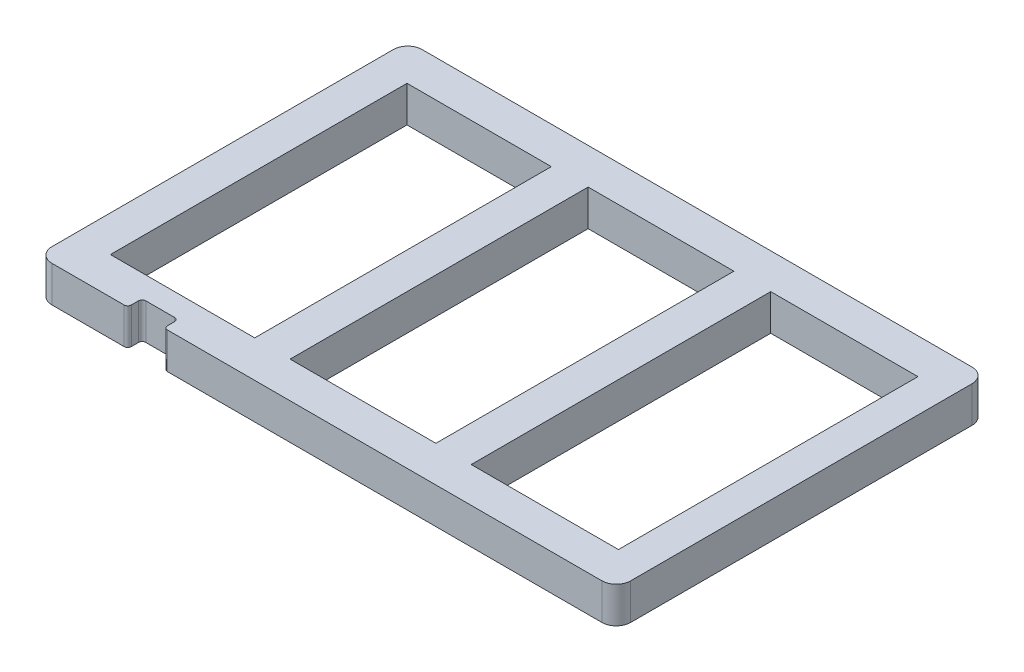
ISO-10303-21;
HEADER;
FILE_DESCRIPTION(('STEP AP214'),'2;1');
FILE_NAME('part.step','',(''),(''),'','','');
FILE_SCHEMA(('AUTOMOTIVE_DESIGN { 1 0 10303 214 1 1 1 1 }'));
ENDSEC;
DATA;
#1=APPLICATION_CONTEXT('core data for automotive mechanical design processes');
#2=APPLICATION_PROTOCOL_DEFINITION('international standard','automotive_design',2000,#1);
#3=PRODUCT_CONTEXT('',#1,'mechanical');
#4=PRODUCT('Part','Part','',(#3));
#5=PRODUCT_RELATED_PRODUCT_CATEGORY('part','',(#4));
#6=PRODUCT_DEFINITION_FORMATION('','',#4);
#7=PRODUCT_DEFINITION_CONTEXT('part definition',#1,'design');
#8=PRODUCT_DEFINITION('design','',#6,#7);
#9=PRODUCT_DEFINITION_SHAPE('','',#8);
#10=(LENGTH_UNIT() NAMED_UNIT(*) SI_UNIT(.MILLI.,.METRE.));
#11=(NAMED_UNIT(*) PLANE_ANGLE_UNIT() SI_UNIT($,.RADIAN.));
#12=(NAMED_UNIT(*) SI_UNIT($,.STERADIAN.) SOLID_ANGLE_UNIT());
#13=UNCERTAINTY_MEASURE_WITH_UNIT(LENGTH_MEASURE(1.E-05),#10,'distance_accuracy_value','');
#14=(GEOMETRIC_REPRESENTATION_CONTEXT(3) GLOBAL_UNCERTAINTY_ASSIGNED_CONTEXT((#13)) GLOBAL_UNIT_ASSIGNED_CONTEXT((#10,
#11,#12)) REPRESENTATION_CONTEXT('',''));
#15=CARTESIAN_POINT('',(0.,0.,0.));
#16=DIRECTION('',(0.,0.,1.));
#17=DIRECTION('',(1.,0.,0.));
#18=AXIS2_PLACEMENT_3D('',#15,#16,#17);
#19=CARTESIAN_POINT('',(3.,5.,25.15));
#20=DIRECTION('',(0.,1.,0.));
#21=DIRECTION('',(0.,0.,1.));
#22=AXIS2_PLACEMENT_3D('',#19,#20,#21);
#23=PLANE('',#22);
#24=CARTESIAN_POINT('',(3.,5.,25.15));
#25=DIRECTION('',(0.,1.,0.));
#26=DIRECTION('',(0.,0.,1.));
#27=AXIS2_PLACEMENT_3D('',#24,#25,#26);
#28=CIRCLE('',#27,0.5);
#29=CARTESIAN_POINT('',(2.5,5.,25.15));
#30=VERTEX_POINT('',#29);
#31=CARTESIAN_POINT('',(3.,5.,25.65));
#32=VERTEX_POINT('',#31);
#33=EDGE_CURVE('E320',#30,#32,#28,.T.);
#34=ORIENTED_EDGE('',*,*,#33,.T.);
#35=DIRECTION('',(1.,0.,0.));
#36=VECTOR('',#35,1.);
#37=CARTESIAN_POINT('',(63.2,5.,25.65));
#38=LINE('',#37,#36);
#39=CARTESIAN_POINT('',(63.2,5.,25.65));
#40=VERTEX_POINT('',#39);
#41=EDGE_CURVE('E323',#32,#40,#38,.T.);
#42=ORIENTED_EDGE('',*,*,#41,.T.);
#43=CARTESIAN_POINT('',(63.2,5.,23.65));
#44=DIRECTION('',(0.,1.,0.));
#45=DIRECTION('',(0.,0.,1.));
#46=AXIS2_PLACEMENT_3D('',#43,#44,#45);
#47=CIRCLE('',#46,2.);
#48=CARTESIAN_POINT('',(65.2,5.,23.65));
#49=VERTEX_POINT('',#48);
#50=EDGE_CURVE('E326',#40,#49,#47,.T.);
#51=ORIENTED_EDGE('',*,*,#50,.T.);
#52=DIRECTION('',(0.,0.,-1.));
#53=VECTOR('',#52,1.);
#54=CARTESIAN_POINT('',(65.2,5.,23.65));
#55=LINE('',#54,#53);
#56=CARTESIAN_POINT('',(65.2,5.,-23.65));
#57=VERTEX_POINT('',#56);
#58=EDGE_CURVE('E328',#49,#57,#55,.T.);
#59=ORIENTED_EDGE('',*,*,#58,.T.);
#60=CARTESIAN_POINT('',(63.2,5.,-23.65));
#61=DIRECTION('',(0.,1.,0.));
#62=DIRECTION('',(0.,0.,1.));
#63=AXIS2_PLACEMENT_3D('',#60,#61,#62);
#64=CIRCLE('',#63,2.);
#65=CARTESIAN_POINT('',(63.2,5.,-25.65));
#66=VERTEX_POINT('',#65);
#67=EDGE_CURVE('E330',#57,#66,#64,.T.);
#68=ORIENTED_EDGE('',*,*,#67,.T.);
#69=DIRECTION('',(-1.,0.,0.));
#70=VECTOR('',#69,1.);
#71=CARTESIAN_POINT('',(63.2,5.,-25.65));
#72=LINE('',#71,#70);
#73=CARTESIAN_POINT('',(-13.,5.,-25.65));
#74=VERTEX_POINT('',#73);
#75=EDGE_CURVE('E332',#66,#74,#72,.T.);
#76=ORIENTED_EDGE('',*,*,#75,.T.);
#77=CARTESIAN_POINT('',(-13.,5.,-23.65));
#78=DIRECTION('',(0.,1.,0.));
#79=DIRECTION('',(0.,0.,1.));
#80=AXIS2_PLACEMENT_3D('',#77,#78,#79);
#81=CIRCLE('',#80,2.);
#82=CARTESIAN_POINT('',(-15.,5.,-23.65));
#83=VERTEX_POINT('',#82);
#84=EDGE_CURVE('E334',#74,#83,#81,.T.);
#85=ORIENTED_EDGE('',*,*,#84,.T.);
#86=DIRECTION('',(0.,0.,1.));
#87=VECTOR('',#86,1.);
#88=CARTESIAN_POINT('',(-15.,5.,23.65));
#89=LINE('',#88,#87);
#90=CARTESIAN_POINT('',(-15.,5.,23.65));
#91=VERTEX_POINT('',#90);
#92=EDGE_CURVE('E336',#83,#91,#89,.T.);
#93=ORIENTED_EDGE('',*,*,#92,.T.);
#94=CARTESIAN_POINT('',(-13.,5.,23.65));
#95=DIRECTION('',(0.,1.,0.));
#96=DIRECTION('',(0.,0.,-1.));
#97=AXIS2_PLACEMENT_3D('',#94,#95,#96);
#98=CIRCLE('',#97,2.);
#99=CARTESIAN_POINT('',(-13.,5.,25.65));
#100=VERTEX_POINT('',#99);
#101=EDGE_CURVE('E338',#91,#100,#98,.T.);
#102=ORIENTED_EDGE('',*,*,#101,.T.);
#103=DIRECTION('',(1.,0.,0.));
#104=VECTOR('',#103,1.);
#105=CARTESIAN_POINT('',(-3.,5.,25.65));
#106=LINE('',#105,#104);
#107=CARTESIAN_POINT('',(-3.,5.,25.65));
#108=VERTEX_POINT('',#107);
#109=EDGE_CURVE('E340',#100,#108,#106,.T.);
#110=ORIENTED_EDGE('',*,*,#109,.T.);
#111=CARTESIAN_POINT('',(-3.,5.,25.15));
#112=DIRECTION('',(0.,1.,0.));
#113=DIRECTION('',(0.,0.,-1.));
#114=AXIS2_PLACEMENT_3D('',#111,#112,#113);
#115=CIRCLE('',#114,0.5);
#116=CARTESIAN_POINT('',(-2.5,5.,25.15));
#117=VERTEX_POINT('',#116);
#118=EDGE_CURVE('E342',#108,#117,#115,.T.);
#119=ORIENTED_EDGE('',*,*,#118,.T.);
#120=DIRECTION('',(0.,0.,-1.));
#121=VECTOR('',#120,1.);
#122=CARTESIAN_POINT('',(-2.5,5.,25.15));
#123=LINE('',#122,#121);
#124=CARTESIAN_POINT('',(-2.5,5.,24.15));
#125=VERTEX_POINT('',#124);
#126=EDGE_CURVE('E344',#117,#125,#123,.T.);
#127=ORIENTED_EDGE('',*,*,#126,.T.);
#128=CARTESIAN_POINT('',(-2.,5.,24.15));
#129=DIRECTION('',(0.,-1.,0.));
#130=DIRECTION('',(0.,0.,-1.));
#131=AXIS2_PLACEMENT_3D('',#128,#129,#130);
#132=CIRCLE('',#131,0.5);
#133=CARTESIAN_POINT('',(-2.,5.,23.65));
#134=VERTEX_POINT('',#133);
#135=EDGE_CURVE('E346',#125,#134,#132,.T.);
#136=ORIENTED_EDGE('',*,*,#135,.T.);
#137=DIRECTION('',(1.,0.,0.));
#138=VECTOR('',#137,1.);
#139=CARTESIAN_POINT('',(-2.,5.,23.65));
#140=LINE('',#139,#138);
#141=CARTESIAN_POINT('',(2.,5.,23.65));
#142=VERTEX_POINT('',#141);
#143=EDGE_CURVE('E348',#134,#142,#140,.T.);
#144=ORIENTED_EDGE('',*,*,#143,.T.);
#145=CARTESIAN_POINT('',(2.,5.,24.15));
#146=DIRECTION('',(0.,-1.,0.));
#147=DIRECTION('',(0.,0.,-1.));
#148=AXIS2_PLACEMENT_3D('',#145,#146,#147);
#149=CIRCLE('',#148,0.5);
#150=CARTESIAN_POINT('',(2.5,5.,24.15));
#151=VERTEX_POINT('',#150);
#152=EDGE_CURVE('E350',#142,#151,#149,.T.);
#153=ORIENTED_EDGE('',*,*,#152,.T.);
#154=DIRECTION('',(0.,0.,1.));
#155=VECTOR('',#154,1.);
#156=CARTESIAN_POINT('',(2.5,5.,24.15));
#157=LINE('',#156,#155);
#158=EDGE_CURVE('E352',#151,#30,#157,.T.);
#159=ORIENTED_EDGE('',*,*,#158,.T.);
#160=EDGE_LOOP('',(#34,#42,#51,#59,#68,#76,#85,#93,#102,#110,#119,#127,#136,#144,#153,#159));
#161=FACE_BOUND('',#160,.T.);
#162=DIRECTION('',(1.,0.,0.));
#163=VECTOR('',#162,1.);
#164=CARTESIAN_POINT('',(9.99999999999999,5.,20.55));
#165=LINE('',#164,#163);
#166=CARTESIAN_POINT('',(-10.,5.,20.55));
#167=VERTEX_POINT('',#166);
#168=CARTESIAN_POINT('',(9.99999999999999,5.,20.55));
#169=VERTEX_POINT('',#168);
#170=EDGE_CURVE('E291',#167,#169,#165,.T.);
#171=ORIENTED_EDGE('',*,*,#170,.F.);
#172=DIRECTION('',(0.,0.,1.));
#173=VECTOR('',#172,1.);
#174=CARTESIAN_POINT('',(-10.,5.,20.55));
#175=LINE('',#174,#173);
#176=CARTESIAN_POINT('',(-10.,5.,-20.55));
#177=VERTEX_POINT('',#176);
#178=EDGE_CURVE('E289',#177,#167,#175,.T.);
#179=ORIENTED_EDGE('',*,*,#178,.F.);
#180=DIRECTION('',(-1.,0.,0.));
#181=VECTOR('',#180,1.);
#182=CARTESIAN_POINT('',(9.99999999999999,5.,-20.55));
#183=LINE('',#182,#181);
#184=CARTESIAN_POINT('',(9.99999999999999,5.,-20.55));
#185=VERTEX_POINT('',#184);
#186=EDGE_CURVE('E297',#185,#177,#183,.T.);
#187=ORIENTED_EDGE('',*,*,#186,.F.);
#188=DIRECTION('',(0.,0.,-1.));
#189=VECTOR('',#188,1.);
#190=CARTESIAN_POINT('',(9.99999999999999,5.,20.55));
#191=LINE('',#190,#189);
#192=EDGE_CURVE('E294',#169,#185,#191,.T.);
#193=ORIENTED_EDGE('',*,*,#192,.F.);
#194=EDGE_LOOP('',(#171,#179,#187,#193));
#195=FACE_BOUND('',#194,.T.);
#196=DIRECTION('',(1.,0.,0.));
#197=VECTOR('',#196,1.);
#198=CARTESIAN_POINT('',(35.2,5.,20.65));
#199=LINE('',#198,#197);
#200=CARTESIAN_POINT('',(15.,5.,20.65));
#201=VERTEX_POINT('',#200);
#202=CARTESIAN_POINT('',(35.2,5.,20.65));
#203=VERTEX_POINT('',#202);
#204=EDGE_CURVE('E260',#201,#203,#199,.T.);
#205=ORIENTED_EDGE('',*,*,#204,.F.);
#206=DIRECTION('',(0.,0.,1.));
#207=VECTOR('',#206,1.);
#208=CARTESIAN_POINT('',(15.,5.,20.65));
#209=LINE('',#208,#207);
#210=CARTESIAN_POINT('',(15.,5.,-20.65));
#211=VERTEX_POINT('',#210);
#212=EDGE_CURVE('E258',#211,#201,#209,.T.);
#213=ORIENTED_EDGE('',*,*,#212,.F.);
#214=DIRECTION('',(-1.,0.,0.));
#215=VECTOR('',#214,1.);
#216=CARTESIAN_POINT('',(35.2,5.,-20.65));
#217=LINE('',#216,#215);
#218=CARTESIAN_POINT('',(35.2,5.,-20.65));
#219=VERTEX_POINT('',#218);
#220=EDGE_CURVE('E266',#219,#211,#217,.T.);
#221=ORIENTED_EDGE('',*,*,#220,.F.);
#222=DIRECTION('',(0.,0.,-1.));
#223=VECTOR('',#222,1.);
#224=CARTESIAN_POINT('',(35.2,5.,20.65));
#225=LINE('',#224,#223);
#226=EDGE_CURVE('E263',#203,#219,#225,.T.);
#227=ORIENTED_EDGE('',*,*,#226,.F.);
#228=EDGE_LOOP('',(#205,#213,#221,#227));
#229=FACE_BOUND('',#228,.T.);
#230=DIRECTION('',(1.,0.,0.));
#231=VECTOR('',#230,1.);
#232=CARTESIAN_POINT('',(60.6,5.,20.75));
#233=LINE('',#232,#231);
#234=CARTESIAN_POINT('',(40.2,5.,20.75));
#235=VERTEX_POINT('',#234);
#236=CARTESIAN_POINT('',(60.6,5.,20.75));
#237=VERTEX_POINT('',#236);
#238=EDGE_CURVE('E230',#235,#237,#233,.T.);
#239=ORIENTED_EDGE('',*,*,#238,.F.);
#240=DIRECTION('',(0.,0.,1.));
#241=VECTOR('',#240,1.);
#242=CARTESIAN_POINT('',(40.2,5.,20.75));
#243=LINE('',#242,#241);
#244=CARTESIAN_POINT('',(40.2,5.,-20.75));
#245=VERTEX_POINT('',#244);
#246=EDGE_CURVE('E222',#245,#235,#243,.T.);
#247=ORIENTED_EDGE('',*,*,#246,.F.);
#248=DIRECTION('',(-1.,0.,0.));
#249=VECTOR('',#248,1.);
#250=CARTESIAN_POINT('',(60.6,5.,-20.75));
#251=LINE('',#250,#249);
#252=CARTESIAN_POINT('',(60.6,5.,-20.75));
#253=VERTEX_POINT('',#252);
#254=EDGE_CURVE('E244',#253,#245,#251,.T.);
#255=ORIENTED_EDGE('',*,*,#254,.F.);
#256=DIRECTION('',(0.,0.,-1.));
#257=VECTOR('',#256,1.);
#258=CARTESIAN_POINT('',(60.6,5.,20.75));
#259=LINE('',#258,#257);
#260=EDGE_CURVE('E242',#237,#253,#259,.T.);
#261=ORIENTED_EDGE('',*,*,#260,.F.);
#262=EDGE_LOOP('',(#239,#247,#255,#261));
#263=FACE_BOUND('',#262,.T.);
#264=ADVANCED_FACE('F37',(#161,#195,#229,#263),#23,.T.);
#265=CARTESIAN_POINT('',(3.,0.,25.15));
#266=DIRECTION('',(0.,1.,0.));
#267=DIRECTION('',(0.,0.,1.));
#268=AXIS2_PLACEMENT_3D('',#265,#266,#267);
#269=PLANE('',#268);
#270=DIRECTION('',(0.,0.,1.));
#271=VECTOR('',#270,1.);
#272=CARTESIAN_POINT('',(15.,0.,20.65));
#273=LINE('',#272,#271);
#274=CARTESIAN_POINT('',(15.,0.,-20.65));
#275=VERTEX_POINT('',#274);
#276=CARTESIAN_POINT('',(15.,0.,20.65));
#277=VERTEX_POINT('',#276);
#278=EDGE_CURVE('E238',#275,#277,#273,.T.);
#279=ORIENTED_EDGE('',*,*,#278,.T.);
#280=DIRECTION('',(1.,0.,0.));
#281=VECTOR('',#280,1.);
#282=CARTESIAN_POINT('',(35.2,0.,20.65));
#283=LINE('',#282,#281);
#284=CARTESIAN_POINT('',(35.2,0.,20.65));
#285=VERTEX_POINT('',#284);
#286=EDGE_CURVE('E271',#277,#285,#283,.T.);
#287=ORIENTED_EDGE('',*,*,#286,.T.);
#288=DIRECTION('',(0.,0.,-1.));
#289=VECTOR('',#288,1.);
#290=CARTESIAN_POINT('',(35.2,0.,20.65));
#291=LINE('',#290,#289);
#292=CARTESIAN_POINT('',(35.2,0.,-20.65));
#293=VERTEX_POINT('',#292);
#294=EDGE_CURVE('E274',#285,#293,#291,.T.);
#295=ORIENTED_EDGE('',*,*,#294,.T.);
#296=DIRECTION('',(-1.,0.,0.));
#297=VECTOR('',#296,1.);
#298=CARTESIAN_POINT('',(35.2,0.,-20.65));
#299=LINE('',#298,#297);
#300=EDGE_CURVE('E261',#293,#275,#299,.T.);
#301=ORIENTED_EDGE('',*,*,#300,.T.);
#302=EDGE_LOOP('',(#279,#287,#295,#301));
#303=FACE_BOUND('',#302,.T.);
#304=CARTESIAN_POINT('',(3.,0.,25.15));
#305=DIRECTION('',(0.,1.,0.));
#306=DIRECTION('',(0.,0.,1.));
#307=AXIS2_PLACEMENT_3D('',#304,#305,#306);
#308=CIRCLE('',#307,0.5);
#309=CARTESIAN_POINT('',(2.5,0.,25.15));
#310=VERTEX_POINT('',#309);
#311=CARTESIAN_POINT('',(3.,0.,25.65));
#312=VERTEX_POINT('',#311);
#313=EDGE_CURVE('E319',#310,#312,#308,.T.);
#314=ORIENTED_EDGE('',*,*,#313,.F.);
#315=DIRECTION('',(0.,0.,1.));
#316=VECTOR('',#315,1.);
#317=CARTESIAN_POINT('',(2.5,0.,24.15));
#318=LINE('',#317,#316);
#319=CARTESIAN_POINT('',(2.5,0.,24.15));
#320=VERTEX_POINT('',#319);
#321=EDGE_CURVE('E324',#320,#310,#318,.T.);
#322=ORIENTED_EDGE('',*,*,#321,.F.);
#323=CARTESIAN_POINT('',(2.,0.,24.15));
#324=DIRECTION('',(0.,-1.,0.));
#325=DIRECTION('',(0.,0.,-1.));
#326=AXIS2_PLACEMENT_3D('',#323,#324,#325);
#327=CIRCLE('',#326,0.5);
#328=CARTESIAN_POINT('',(2.,0.,23.65));
#329=VERTEX_POINT('',#328);
#330=EDGE_CURVE('E383',#329,#320,#327,.T.);
#331=ORIENTED_EDGE('',*,*,#330,.F.);
#332=DIRECTION('',(1.,0.,0.));
#333=VECTOR('',#332,1.);
#334=CARTESIAN_POINT('',(-2.,0.,23.65));
#335=LINE('',#334,#333);
#336=CARTESIAN_POINT('',(-2.,0.,23.65));
#337=VERTEX_POINT('',#336);
#338=EDGE_CURVE('E381',#337,#329,#335,.T.);
#339=ORIENTED_EDGE('',*,*,#338,.F.);
#340=CARTESIAN_POINT('',(-2.,0.,24.15));
#341=DIRECTION('',(0.,-1.,0.));
#342=DIRECTION('',(0.,0.,-1.));
#343=AXIS2_PLACEMENT_3D('',#340,#341,#342);
#344=CIRCLE('',#343,0.5);
#345=CARTESIAN_POINT('',(-2.5,0.,24.15));
#346=VERTEX_POINT('',#345);
#347=EDGE_CURVE('E379',#346,#337,#344,.T.);
#348=ORIENTED_EDGE('',*,*,#347,.F.);
#349=DIRECTION('',(0.,0.,-1.));
#350=VECTOR('',#349,1.);
#351=CARTESIAN_POINT('',(-2.5,0.,25.15));
#352=LINE('',#351,#350);
#353=CARTESIAN_POINT('',(-2.5,0.,25.15));
#354=VERTEX_POINT('',#353);
#355=EDGE_CURVE('E377',#354,#346,#352,.T.);
#356=ORIENTED_EDGE('',*,*,#355,.F.);
#357=CARTESIAN_POINT('',(-3.,0.,25.15));
#358=DIRECTION('',(0.,1.,0.));
#359=DIRECTION('',(0.,0.,-1.));
#360=AXIS2_PLACEMENT_3D('',#357,#358,#359);
#361=CIRCLE('',#360,0.5);
#362=CARTESIAN_POINT('',(-3.,0.,25.65));
#363=VERTEX_POINT('',#362);
#364=EDGE_CURVE('E375',#363,#354,#361,.T.);
#365=ORIENTED_EDGE('',*,*,#364,.F.);
#366=DIRECTION('',(1.,0.,0.));
#367=VECTOR('',#366,1.);
#368=CARTESIAN_POINT('',(-3.,0.,25.65));
#369=LINE('',#368,#367);
#370=CARTESIAN_POINT('',(-13.,0.,25.65));
#371=VERTEX_POINT('',#370);
#372=EDGE_CURVE('E373',#371,#363,#369,.T.);
#373=ORIENTED_EDGE('',*,*,#372,.F.);
#374=CARTESIAN_POINT('',(-13.,0.,23.65));
#375=DIRECTION('',(0.,1.,0.));
#376=DIRECTION('',(0.,0.,-1.));
#377=AXIS2_PLACEMENT_3D('',#374,#375,#376);
#378=CIRCLE('',#377,2.);
#379=CARTESIAN_POINT('',(-15.,0.,23.65));
#380=VERTEX_POINT('',#379);
#381=EDGE_CURVE('E371',#380,#371,#378,.T.);
#382=ORIENTED_EDGE('',*,*,#381,.F.);
#383=DIRECTION('',(0.,0.,1.));
#384=VECTOR('',#383,1.);
#385=CARTESIAN_POINT('',(-15.,0.,23.65));
#386=LINE('',#385,#384);
#387=CARTESIAN_POINT('',(-15.,0.,-23.65));
#388=VERTEX_POINT('',#387);
#389=EDGE_CURVE('E369',#388,#380,#386,.T.);
#390=ORIENTED_EDGE('',*,*,#389,.F.);
#391=CARTESIAN_POINT('',(-13.,0.,-23.65));
#392=DIRECTION('',(0.,1.,0.));
#393=DIRECTION('',(0.,0.,1.));
#394=AXIS2_PLACEMENT_3D('',#391,#392,#393);
#395=CIRCLE('',#394,2.);
#396=CARTESIAN_POINT('',(-13.,0.,-25.65));
#397=VERTEX_POINT('',#396);
#398=EDGE_CURVE('E367',#397,#388,#395,.T.);
#399=ORIENTED_EDGE('',*,*,#398,.F.);
#400=DIRECTION('',(-1.,0.,0.));
#401=VECTOR('',#400,1.);
#402=CARTESIAN_POINT('',(63.2,0.,-25.65));
#403=LINE('',#402,#401);
#404=CARTESIAN_POINT('',(63.2,0.,-25.65));
#405=VERTEX_POINT('',#404);
#406=EDGE_CURVE('E365',#405,#397,#403,.T.);
#407=ORIENTED_EDGE('',*,*,#406,.F.);
#408=CARTESIAN_POINT('',(63.2,0.,-23.65));
#409=DIRECTION('',(0.,1.,0.));
#410=DIRECTION('',(0.,0.,1.));
#411=AXIS2_PLACEMENT_3D('',#408,#409,#410);
#412=CIRCLE('',#411,2.);
#413=CARTESIAN_POINT('',(65.2,0.,-23.65));
#414=VERTEX_POINT('',#413);
#415=EDGE_CURVE('E363',#414,#405,#412,.T.);
#416=ORIENTED_EDGE('',*,*,#415,.F.);
#417=DIRECTION('',(0.,0.,-1.));
#418=VECTOR('',#417,1.);
#419=CARTESIAN_POINT('',(65.2,0.,23.65));
#420=LINE('',#419,#418);
#421=CARTESIAN_POINT('',(65.2,0.,23.65));
#422=VERTEX_POINT('',#421);
#423=EDGE_CURVE('E361',#422,#414,#420,.T.);
#424=ORIENTED_EDGE('',*,*,#423,.F.);
#425=CARTESIAN_POINT('',(63.2,0.,23.65));
#426=DIRECTION('',(0.,1.,0.));
#427=DIRECTION('',(0.,0.,1.));
#428=AXIS2_PLACEMENT_3D('',#425,#426,#427);
#429=CIRCLE('',#428,2.);
#430=CARTESIAN_POINT('',(63.2,0.,25.65));
#431=VERTEX_POINT('',#430);
#432=EDGE_CURVE('E359',#431,#422,#429,.T.);
#433=ORIENTED_EDGE('',*,*,#432,.F.);
#434=DIRECTION('',(1.,0.,0.));
#435=VECTOR('',#434,1.);
#436=CARTESIAN_POINT('',(63.2,0.,25.65));
#437=LINE('',#436,#435);
#438=EDGE_CURVE('E357',#312,#431,#437,.T.);
#439=ORIENTED_EDGE('',*,*,#438,.F.);
#440=EDGE_LOOP('',(#314,#322,#331,#339,#348,#356,#365,#373,#382,#390,#399,#407,#416,#424,#433,#439));
#441=FACE_BOUND('',#440,.T.);
#442=DIRECTION('',(0.,0.,1.));
#443=VECTOR('',#442,1.);
#444=CARTESIAN_POINT('',(-10.,0.,20.55));
#445=LINE('',#444,#443);
#446=CARTESIAN_POINT('',(-10.,0.,-20.55));
#447=VERTEX_POINT('',#446);
#448=CARTESIAN_POINT('',(-10.,0.,20.55));
#449=VERTEX_POINT('',#448);
#450=EDGE_CURVE('E288',#447,#449,#445,.T.);
#451=ORIENTED_EDGE('',*,*,#450,.T.);
#452=DIRECTION('',(1.,0.,0.));
#453=VECTOR('',#452,1.);
#454=CARTESIAN_POINT('',(9.99999999999999,0.,20.55));
#455=LINE('',#454,#453);
#456=CARTESIAN_POINT('',(9.99999999999999,0.,20.55));
#457=VERTEX_POINT('',#456);
#458=EDGE_CURVE('E302',#449,#457,#455,.T.);
#459=ORIENTED_EDGE('',*,*,#458,.T.);
#460=DIRECTION('',(0.,0.,-1.));
#461=VECTOR('',#460,1.);
#462=CARTESIAN_POINT('',(9.99999999999999,0.,20.55));
#463=LINE('',#462,#461);
#464=CARTESIAN_POINT('',(9.99999999999999,0.,-20.55));
#465=VERTEX_POINT('',#464);
#466=EDGE_CURVE('E305',#457,#465,#463,.T.);
#467=ORIENTED_EDGE('',*,*,#466,.T.);
#468=DIRECTION('',(-1.,0.,0.));
#469=VECTOR('',#468,1.);
#470=CARTESIAN_POINT('',(9.99999999999999,0.,-20.55));
#471=LINE('',#470,#469);
#472=EDGE_CURVE('E292',#465,#447,#471,.T.);
#473=ORIENTED_EDGE('',*,*,#472,.T.);
#474=EDGE_LOOP('',(#451,#459,#467,#473));
#475=FACE_BOUND('',#474,.T.);
#476=DIRECTION('',(0.,0.,1.));
#477=VECTOR('',#476,1.);
#478=CARTESIAN_POINT('',(40.2,0.,20.75));
#479=LINE('',#478,#477);
#480=CARTESIAN_POINT('',(40.2,0.,-20.75));
#481=VERTEX_POINT('',#480);
#482=CARTESIAN_POINT('',(40.2,0.,20.75));
#483=VERTEX_POINT('',#482);
#484=EDGE_CURVE('E60',#481,#483,#479,.T.);
#485=ORIENTED_EDGE('',*,*,#484,.T.);
#486=DIRECTION('',(1.,0.,0.));
#487=VECTOR('',#486,1.);
#488=CARTESIAN_POINT('',(60.6,0.,20.75));
#489=LINE('',#488,#487);
#490=CARTESIAN_POINT('',(60.6,0.,20.75));
#491=VERTEX_POINT('',#490);
#492=EDGE_CURVE('E237',#483,#491,#489,.T.);
#493=ORIENTED_EDGE('',*,*,#492,.T.);
#494=DIRECTION('',(0.,0.,-1.));
#495=VECTOR('',#494,1.);
#496=CARTESIAN_POINT('',(60.6,0.,20.75));
#497=LINE('',#496,#495);
#498=CARTESIAN_POINT('',(60.6,0.,-20.75));
#499=VERTEX_POINT('',#498);
#500=EDGE_CURVE('E250',#491,#499,#497,.T.);
#501=ORIENTED_EDGE('',*,*,#500,.T.);
#502=DIRECTION('',(-1.,0.,0.));
#503=VECTOR('',#502,1.);
#504=CARTESIAN_POINT('',(60.6,0.,-20.75));
#505=LINE('',#504,#503);
#506=EDGE_CURVE('E231',#499,#481,#505,.T.);
#507=ORIENTED_EDGE('',*,*,#506,.T.);
#508=EDGE_LOOP('',(#485,#493,#501,#507));
#509=FACE_BOUND('',#508,.T.);
#510=ADVANCED_FACE('F437',(#303,#441,#475,#509),#269,.F.);
#511=CARTESIAN_POINT('',(3.,5.,25.15));
#512=DIRECTION('',(0.,-1.,0.));
#513=DIRECTION('',(0.,0.,-1.));
#514=AXIS2_PLACEMENT_3D('',#511,#512,#513);
#515=CYLINDRICAL_SURFACE('',#514,0.5);
#516=ORIENTED_EDGE('',*,*,#313,.T.);
#517=DIRECTION('',(0.,-1.,0.));
#518=VECTOR('',#517,1.);
#519=CARTESIAN_POINT('',(3.,5.,25.65));
#520=LINE('',#519,#518);
#521=EDGE_CURVE('E11',#32,#312,#520,.T.);
#522=ORIENTED_EDGE('',*,*,#521,.F.);
#523=ORIENTED_EDGE('',*,*,#33,.F.);
#524=DIRECTION('',(0.,-1.,0.));
#525=VECTOR('',#524,1.);
#526=CARTESIAN_POINT('',(2.5,5.,25.15));
#527=LINE('',#526,#525);
#528=EDGE_CURVE('E354',#30,#310,#527,.T.);
#529=ORIENTED_EDGE('',*,*,#528,.T.);
#530=EDGE_LOOP('',(#516,#522,#523,#529));
#531=FACE_BOUND('',#530,.T.);
#532=ADVANCED_FACE('F39',(#531),#515,.T.);
#533=CARTESIAN_POINT('',(63.2,5.,25.65));
#534=DIRECTION('',(0.,0.,-1.));
#535=DIRECTION('',(-1.,0.,0.));
#536=AXIS2_PLACEMENT_3D('',#533,#534,#535);
#537=PLANE('',#536);
#538=ORIENTED_EDGE('',*,*,#438,.T.);
#539=DIRECTION('',(0.,-1.,0.));
#540=VECTOR('',#539,1.);
#541=CARTESIAN_POINT('',(63.2,5.,25.65));
#542=LINE('',#541,#540);
#543=EDGE_CURVE('E45',#40,#431,#542,.T.);
#544=ORIENTED_EDGE('',*,*,#543,.F.);
#545=ORIENTED_EDGE('',*,*,#41,.F.);
#546=ORIENTED_EDGE('',*,*,#521,.T.);
#547=EDGE_LOOP('',(#538,#544,#545,#546));
#548=FACE_BOUND('',#547,.T.);
#549=ADVANCED_FACE('F455',(#548),#537,.F.);
#550=CARTESIAN_POINT('',(63.2,5.,23.65));
#551=DIRECTION('',(0.,-1.,0.));
#552=DIRECTION('',(0.,0.,-1.));
#553=AXIS2_PLACEMENT_3D('',#550,#551,#552);
#554=CYLINDRICAL_SURFACE('',#553,2.);
#555=ORIENTED_EDGE('',*,*,#432,.T.);
#556=DIRECTION('',(0.,-1.,0.));
#557=VECTOR('',#556,1.);
#558=CARTESIAN_POINT('',(65.2,5.,23.65));
#559=LINE('',#558,#557);
#560=EDGE_CURVE('E424',#49,#422,#559,.T.);
#561=ORIENTED_EDGE('',*,*,#560,.F.);
#562=ORIENTED_EDGE('',*,*,#50,.F.);
#563=ORIENTED_EDGE('',*,*,#543,.T.);
#564=EDGE_LOOP('',(#555,#561,#562,#563));
#565=FACE_BOUND('',#564,.T.);
#566=ADVANCED_FACE('F431',(#565),#554,.T.);
#567=CARTESIAN_POINT('',(65.2,5.,23.65));
#568=DIRECTION('',(-1.,0.,0.));
#569=DIRECTION('',(0.,0.,1.));
#570=AXIS2_PLACEMENT_3D('',#567,#568,#569);
#571=PLANE('',#570);
#572=ORIENTED_EDGE('',*,*,#423,.T.);
#573=DIRECTION('',(0.,-1.,0.));
#574=VECTOR('',#573,1.);
#575=CARTESIAN_POINT('',(65.2,5.,-23.65));
#576=LINE('',#575,#574);
#577=EDGE_CURVE('E421',#57,#414,#576,.T.);
#578=ORIENTED_EDGE('',*,*,#577,.F.);
#579=ORIENTED_EDGE('',*,*,#58,.F.);
#580=ORIENTED_EDGE('',*,*,#560,.T.);
#581=EDGE_LOOP('',(#572,#578,#579,#580));
#582=FACE_BOUND('',#581,.T.);
#583=ADVANCED_FACE('F443',(#582),#571,.F.);
#584=CARTESIAN_POINT('',(63.2,5.,-23.65));
#585=DIRECTION('',(0.,-1.,0.));
#586=DIRECTION('',(0.,0.,-1.));
#587=AXIS2_PLACEMENT_3D('',#584,#585,#586);
#588=CYLINDRICAL_SURFACE('',#587,2.);
#589=ORIENTED_EDGE('',*,*,#415,.T.);
#590=DIRECTION('',(0.,-1.,0.));
#591=VECTOR('',#590,1.);
#592=CARTESIAN_POINT('',(63.2,5.,-25.65));
#593=LINE('',#592,#591);
#594=EDGE_CURVE('E418',#66,#405,#593,.T.);
#595=ORIENTED_EDGE('',*,*,#594,.F.);
#596=ORIENTED_EDGE('',*,*,#67,.F.);
#597=ORIENTED_EDGE('',*,*,#577,.T.);
#598=EDGE_LOOP('',(#589,#595,#596,#597));
#599=FACE_BOUND('',#598,.T.);
#600=ADVANCED_FACE('F447',(#599),#588,.T.);
#601=CARTESIAN_POINT('',(63.2,5.,-25.65));
#602=DIRECTION('',(0.,0.,1.));
#603=DIRECTION('',(1.,0.,0.));
#604=AXIS2_PLACEMENT_3D('',#601,#602,#603);
#605=PLANE('',#604);
#606=ORIENTED_EDGE('',*,*,#406,.T.);
#607=DIRECTION('',(0.,-1.,0.));
#608=VECTOR('',#607,1.);
#609=CARTESIAN_POINT('',(-13.,5.,-25.65));
#610=LINE('',#609,#608);
#611=EDGE_CURVE('E415',#74,#397,#610,.T.);
#612=ORIENTED_EDGE('',*,*,#611,.F.);
#613=ORIENTED_EDGE('',*,*,#75,.F.);
#614=ORIENTED_EDGE('',*,*,#594,.T.);
#615=EDGE_LOOP('',(#606,#612,#613,#614));
#616=FACE_BOUND('',#615,.T.);
#617=ADVANCED_FACE('F508',(#616),#605,.F.);
#618=CARTESIAN_POINT('',(-13.,5.,-23.65));
#619=DIRECTION('',(0.,-1.,0.));
#620=DIRECTION('',(0.,0.,-1.));
#621=AXIS2_PLACEMENT_3D('',#618,#619,#620);
#622=CYLINDRICAL_SURFACE('',#621,2.);
#623=ORIENTED_EDGE('',*,*,#398,.T.);
#624=DIRECTION('',(0.,-1.,0.));
#625=VECTOR('',#624,1.);
#626=CARTESIAN_POINT('',(-15.,5.,-23.65));
#627=LINE('',#626,#625);
#628=EDGE_CURVE('E412',#83,#388,#627,.T.);
#629=ORIENTED_EDGE('',*,*,#628,.F.);
#630=ORIENTED_EDGE('',*,*,#84,.F.);
#631=ORIENTED_EDGE('',*,*,#611,.T.);
#632=EDGE_LOOP('',(#623,#629,#630,#631));
#633=FACE_BOUND('',#632,.T.);
#634=ADVANCED_FACE('F505',(#633),#622,.T.);
#635=CARTESIAN_POINT('',(-15.,5.,23.65));
#636=DIRECTION('',(1.,0.,0.));
#637=DIRECTION('',(0.,0.,-1.));
#638=AXIS2_PLACEMENT_3D('',#635,#636,#637);
#639=PLANE('',#638);
#640=ORIENTED_EDGE('',*,*,#389,.T.);
#641=DIRECTION('',(0.,-1.,0.));
#642=VECTOR('',#641,1.);
#643=CARTESIAN_POINT('',(-15.,5.,23.65));
#644=LINE('',#643,#642);
#645=EDGE_CURVE('E409',#91,#380,#644,.T.);
#646=ORIENTED_EDGE('',*,*,#645,.F.);
#647=ORIENTED_EDGE('',*,*,#92,.F.);
#648=ORIENTED_EDGE('',*,*,#628,.T.);
#649=EDGE_LOOP('',(#640,#646,#647,#648));
#650=FACE_BOUND('',#649,.T.);
#651=ADVANCED_FACE('F501',(#650),#639,.F.);
#652=CARTESIAN_POINT('',(-13.,5.,23.65));
#653=DIRECTION('',(0.,-1.,0.));
#654=DIRECTION('',(0.,0.,-1.));
#655=AXIS2_PLACEMENT_3D('',#652,#653,#654);
#656=CYLINDRICAL_SURFACE('',#655,2.);
#657=ORIENTED_EDGE('',*,*,#381,.T.);
#658=DIRECTION('',(0.,-1.,0.));
#659=VECTOR('',#658,1.);
#660=CARTESIAN_POINT('',(-13.,5.,25.65));
#661=LINE('',#660,#659);
#662=EDGE_CURVE('E406',#100,#371,#661,.T.);
#663=ORIENTED_EDGE('',*,*,#662,.F.);
#664=ORIENTED_EDGE('',*,*,#101,.F.);
#665=ORIENTED_EDGE('',*,*,#645,.T.);
#666=EDGE_LOOP('',(#657,#663,#664,#665));
#667=FACE_BOUND('',#666,.T.);
#668=ADVANCED_FACE('F497',(#667),#656,.T.);
#669=CARTESIAN_POINT('',(-3.,5.,25.65));
#670=DIRECTION('',(0.,0.,-1.));
#671=DIRECTION('',(-1.,0.,0.));
#672=AXIS2_PLACEMENT_3D('',#669,#670,#671);
#673=PLANE('',#672);
#674=ORIENTED_EDGE('',*,*,#372,.T.);
#675=DIRECTION('',(0.,-1.,0.));
#676=VECTOR('',#675,1.);
#677=CARTESIAN_POINT('',(-3.,5.,25.65));
#678=LINE('',#677,#676);
#679=EDGE_CURVE('E403',#108,#363,#678,.T.);
#680=ORIENTED_EDGE('',*,*,#679,.F.);
#681=ORIENTED_EDGE('',*,*,#109,.F.);
#682=ORIENTED_EDGE('',*,*,#662,.T.);
#683=EDGE_LOOP('',(#674,#680,#681,#682));
#684=FACE_BOUND('',#683,.T.);
#685=ADVANCED_FACE('F492',(#684),#673,.F.);
#686=CARTESIAN_POINT('',(-3.,5.,25.15));
#687=DIRECTION('',(0.,-1.,0.));
#688=DIRECTION('',(0.,0.,-1.));
#689=AXIS2_PLACEMENT_3D('',#686,#687,#688);
#690=CYLINDRICAL_SURFACE('',#689,0.5);
#691=ORIENTED_EDGE('',*,*,#364,.T.);
#692=DIRECTION('',(0.,-1.,0.));
#693=VECTOR('',#692,1.);
#694=CARTESIAN_POINT('',(-2.5,5.,25.15));
#695=LINE('',#694,#693);
#696=EDGE_CURVE('E400',#117,#354,#695,.T.);
#697=ORIENTED_EDGE('',*,*,#696,.F.);
#698=ORIENTED_EDGE('',*,*,#118,.F.);
#699=ORIENTED_EDGE('',*,*,#679,.T.);
#700=EDGE_LOOP('',(#691,#697,#698,#699));
#701=FACE_BOUND('',#700,.T.);
#702=ADVANCED_FACE('F486',(#701),#690,.T.);
#703=CARTESIAN_POINT('',(-2.5,5.,25.15));
#704=DIRECTION('',(-1.,0.,0.));
#705=DIRECTION('',(0.,0.,1.));
#706=AXIS2_PLACEMENT_3D('',#703,#704,#705);
#707=PLANE('',#706);
#708=ORIENTED_EDGE('',*,*,#355,.T.);
#709=DIRECTION('',(0.,-1.,0.));
#710=VECTOR('',#709,1.);
#711=CARTESIAN_POINT('',(-2.5,5.,24.15));
#712=LINE('',#711,#710);
#713=EDGE_CURVE('E397',#125,#346,#712,.T.);
#714=ORIENTED_EDGE('',*,*,#713,.F.);
#715=ORIENTED_EDGE('',*,*,#126,.F.);
#716=ORIENTED_EDGE('',*,*,#696,.T.);
#717=EDGE_LOOP('',(#708,#714,#715,#716));
#718=FACE_BOUND('',#717,.T.);
#719=ADVANCED_FACE('F482',(#718),#707,.F.);
#720=CARTESIAN_POINT('',(-2.,5.,24.15));
#721=DIRECTION('',(0.,-1.,0.));
#722=DIRECTION('',(0.,0.,-1.));
#723=AXIS2_PLACEMENT_3D('',#720,#721,#722);
#724=CYLINDRICAL_SURFACE('',#723,0.5);
#725=ORIENTED_EDGE('',*,*,#347,.T.);
#726=DIRECTION('',(0.,-1.,0.));
#727=VECTOR('',#726,1.);
#728=CARTESIAN_POINT('',(-2.,5.,23.65));
#729=LINE('',#728,#727);
#730=EDGE_CURVE('E394',#134,#337,#729,.T.);
#731=ORIENTED_EDGE('',*,*,#730,.F.);
#732=ORIENTED_EDGE('',*,*,#135,.F.);
#733=ORIENTED_EDGE('',*,*,#713,.T.);
#734=EDGE_LOOP('',(#725,#731,#732,#733));
#735=FACE_BOUND('',#734,.T.);
#736=ADVANCED_FACE('F477',(#735),#724,.F.);
#737=CARTESIAN_POINT('',(-2.,5.,23.65));
#738=DIRECTION('',(0.,0.,-1.));
#739=DIRECTION('',(-1.,0.,0.));
#740=AXIS2_PLACEMENT_3D('',#737,#738,#739);
#741=PLANE('',#740);
#742=ORIENTED_EDGE('',*,*,#338,.T.);
#743=DIRECTION('',(0.,-1.,0.));
#744=VECTOR('',#743,1.);
#745=CARTESIAN_POINT('',(2.,5.,23.65));
#746=LINE('',#745,#744);
#747=EDGE_CURVE('E391',#142,#329,#746,.T.);
#748=ORIENTED_EDGE('',*,*,#747,.F.);
#749=ORIENTED_EDGE('',*,*,#143,.F.);
#750=ORIENTED_EDGE('',*,*,#730,.T.);
#751=EDGE_LOOP('',(#742,#748,#749,#750));
#752=FACE_BOUND('',#751,.T.);
#753=ADVANCED_FACE('F471',(#752),#741,.F.);
#754=CARTESIAN_POINT('',(2.,5.,24.15));
#755=DIRECTION('',(0.,-1.,0.));
#756=DIRECTION('',(0.,0.,-1.));
#757=AXIS2_PLACEMENT_3D('',#754,#755,#756);
#758=CYLINDRICAL_SURFACE('',#757,0.5);
#759=ORIENTED_EDGE('',*,*,#330,.T.);
#760=DIRECTION('',(0.,-1.,0.));
#761=VECTOR('',#760,1.);
#762=CARTESIAN_POINT('',(2.5,5.,24.15));
#763=LINE('',#762,#761);
#764=EDGE_CURVE('E388',#151,#320,#763,.T.);
#765=ORIENTED_EDGE('',*,*,#764,.F.);
#766=ORIENTED_EDGE('',*,*,#152,.F.);
#767=ORIENTED_EDGE('',*,*,#747,.T.);
#768=EDGE_LOOP('',(#759,#765,#766,#767));
#769=FACE_BOUND('',#768,.T.);
#770=ADVANCED_FACE('F467',(#769),#758,.F.);
#771=CARTESIAN_POINT('',(2.5,5.,24.15));
#772=DIRECTION('',(1.,0.,0.));
#773=DIRECTION('',(0.,0.,-1.));
#774=AXIS2_PLACEMENT_3D('',#771,#772,#773);
#775=PLANE('',#774);
#776=ORIENTED_EDGE('',*,*,#321,.T.);
#777=ORIENTED_EDGE('',*,*,#528,.F.);
#778=ORIENTED_EDGE('',*,*,#158,.F.);
#779=ORIENTED_EDGE('',*,*,#764,.T.);
#780=EDGE_LOOP('',(#776,#777,#778,#779));
#781=FACE_BOUND('',#780,.T.);
#782=ADVANCED_FACE('F462',(#781),#775,.F.);
#783=CARTESIAN_POINT('',(-10.,5.,20.55));
#784=DIRECTION('',(1.,0.,0.));
#785=DIRECTION('',(0.,0.,-1.));
#786=AXIS2_PLACEMENT_3D('',#783,#784,#785);
#787=PLANE('',#786);
#788=ORIENTED_EDGE('',*,*,#450,.F.);
#789=DIRECTION('',(0.,-1.,0.));
#790=VECTOR('',#789,1.);
#791=CARTESIAN_POINT('',(-10.,5.,-20.55));
#792=LINE('',#791,#790);
#793=EDGE_CURVE('E299',#177,#447,#792,.T.);
#794=ORIENTED_EDGE('',*,*,#793,.F.);
#795=ORIENTED_EDGE('',*,*,#178,.T.);
#796=DIRECTION('',(0.,-1.,0.));
#797=VECTOR('',#796,1.);
#798=CARTESIAN_POINT('',(-10.,5.,20.55));
#799=LINE('',#798,#797);
#800=EDGE_CURVE('E316',#167,#449,#799,.T.);
#801=ORIENTED_EDGE('',*,*,#800,.T.);
#802=EDGE_LOOP('',(#788,#794,#795,#801));
#803=FACE_BOUND('',#802,.T.);
#804=ADVANCED_FACE('F525',(#803),#787,.T.);
#805=CARTESIAN_POINT('',(9.99999999999999,5.,20.55));
#806=DIRECTION('',(0.,0.,-1.));
#807=DIRECTION('',(-1.,0.,0.));
#808=AXIS2_PLACEMENT_3D('',#805,#806,#807);
#809=PLANE('',#808);
#810=ORIENTED_EDGE('',*,*,#458,.F.);
#811=ORIENTED_EDGE('',*,*,#800,.F.);
#812=ORIENTED_EDGE('',*,*,#170,.T.);
#813=DIRECTION('',(0.,-1.,0.));
#814=VECTOR('',#813,1.);
#815=CARTESIAN_POINT('',(9.99999999999999,5.,20.55));
#816=LINE('',#815,#814);
#817=EDGE_CURVE('E314',#169,#457,#816,.T.);
#818=ORIENTED_EDGE('',*,*,#817,.T.);
#819=EDGE_LOOP('',(#810,#811,#812,#818));
#820=FACE_BOUND('',#819,.T.);
#821=ADVANCED_FACE('F587',(#820),#809,.T.);
#822=CARTESIAN_POINT('',(9.99999999999999,5.,20.55));
#823=DIRECTION('',(-1.,0.,0.));
#824=DIRECTION('',(0.,0.,1.));
#825=AXIS2_PLACEMENT_3D('',#822,#823,#824);
#826=PLANE('',#825);
#827=ORIENTED_EDGE('',*,*,#466,.F.);
#828=ORIENTED_EDGE('',*,*,#817,.F.);
#829=ORIENTED_EDGE('',*,*,#192,.T.);
#830=DIRECTION('',(0.,-1.,0.));
#831=VECTOR('',#830,1.);
#832=CARTESIAN_POINT('',(9.99999999999999,5.,-20.55));
#833=LINE('',#832,#831);
#834=EDGE_CURVE('E312',#185,#465,#833,.T.);
#835=ORIENTED_EDGE('',*,*,#834,.T.);
#836=EDGE_LOOP('',(#827,#828,#829,#835));
#837=FACE_BOUND('',#836,.T.);
#838=ADVANCED_FACE('F594',(#837),#826,.T.);
#839=CARTESIAN_POINT('',(9.99999999999999,5.,-20.55));
#840=DIRECTION('',(0.,0.,1.));
#841=DIRECTION('',(1.,0.,0.));
#842=AXIS2_PLACEMENT_3D('',#839,#840,#841);
#843=PLANE('',#842);
#844=ORIENTED_EDGE('',*,*,#472,.F.);
#845=ORIENTED_EDGE('',*,*,#834,.F.);
#846=ORIENTED_EDGE('',*,*,#186,.T.);
#847=ORIENTED_EDGE('',*,*,#793,.T.);
#848=EDGE_LOOP('',(#844,#845,#846,#847));
#849=FACE_BOUND('',#848,.T.);
#850=ADVANCED_FACE('F601',(#849),#843,.T.);
#851=CARTESIAN_POINT('',(15.,5.,20.65));
#852=DIRECTION('',(1.,0.,0.));
#853=DIRECTION('',(0.,0.,-1.));
#854=AXIS2_PLACEMENT_3D('',#851,#852,#853);
#855=PLANE('',#854);
#856=ORIENTED_EDGE('',*,*,#278,.F.);
#857=DIRECTION('',(0.,-1.,0.));
#858=VECTOR('',#857,1.);
#859=CARTESIAN_POINT('',(15.,5.,-20.65));
#860=LINE('',#859,#858);
#861=EDGE_CURVE('E268',#211,#275,#860,.T.);
#862=ORIENTED_EDGE('',*,*,#861,.F.);
#863=ORIENTED_EDGE('',*,*,#212,.T.);
#864=DIRECTION('',(0.,-1.,0.));
#865=VECTOR('',#864,1.);
#866=CARTESIAN_POINT('',(15.,5.,20.65));
#867=LINE('',#866,#865);
#868=EDGE_CURVE('E285',#201,#277,#867,.T.);
#869=ORIENTED_EDGE('',*,*,#868,.T.);
#870=EDGE_LOOP('',(#856,#862,#863,#869));
#871=FACE_BOUND('',#870,.T.);
#872=ADVANCED_FACE('F609',(#871),#855,.T.);
#873=CARTESIAN_POINT('',(35.2,5.,20.65));
#874=DIRECTION('',(0.,0.,-1.));
#875=DIRECTION('',(-1.,0.,0.));
#876=AXIS2_PLACEMENT_3D('',#873,#874,#875);
#877=PLANE('',#876);
#878=ORIENTED_EDGE('',*,*,#286,.F.);
#879=ORIENTED_EDGE('',*,*,#868,.F.);
#880=ORIENTED_EDGE('',*,*,#204,.T.);
#881=DIRECTION('',(0.,-1.,0.));
#882=VECTOR('',#881,1.);
#883=CARTESIAN_POINT('',(35.2,5.,20.65));
#884=LINE('',#883,#882);
#885=EDGE_CURVE('E283',#203,#285,#884,.T.);
#886=ORIENTED_EDGE('',*,*,#885,.T.);
#887=EDGE_LOOP('',(#878,#879,#880,#886));
#888=FACE_BOUND('',#887,.T.);
#889=ADVANCED_FACE('F617',(#888),#877,.T.);
#890=CARTESIAN_POINT('',(35.2,5.,20.65));
#891=DIRECTION('',(-1.,0.,0.));
#892=DIRECTION('',(0.,0.,1.));
#893=AXIS2_PLACEMENT_3D('',#890,#891,#892);
#894=PLANE('',#893);
#895=ORIENTED_EDGE('',*,*,#294,.F.);
#896=ORIENTED_EDGE('',*,*,#885,.F.);
#897=ORIENTED_EDGE('',*,*,#226,.T.);
#898=DIRECTION('',(0.,-1.,0.));
#899=VECTOR('',#898,1.);
#900=CARTESIAN_POINT('',(35.2,5.,-20.65));
#901=LINE('',#900,#899);
#902=EDGE_CURVE('E281',#219,#293,#901,.T.);
#903=ORIENTED_EDGE('',*,*,#902,.T.);
#904=EDGE_LOOP('',(#895,#896,#897,#903));
#905=FACE_BOUND('',#904,.T.);
#906=ADVANCED_FACE('F625',(#905),#894,.T.);
#907=CARTESIAN_POINT('',(35.2,5.,-20.65));
#908=DIRECTION('',(0.,0.,1.));
#909=DIRECTION('',(1.,0.,0.));
#910=AXIS2_PLACEMENT_3D('',#907,#908,#909);
#911=PLANE('',#910);
#912=ORIENTED_EDGE('',*,*,#300,.F.);
#913=ORIENTED_EDGE('',*,*,#902,.F.);
#914=ORIENTED_EDGE('',*,*,#220,.T.);
#915=ORIENTED_EDGE('',*,*,#861,.T.);
#916=EDGE_LOOP('',(#912,#913,#914,#915));
#917=FACE_BOUND('',#916,.T.);
#918=ADVANCED_FACE('F633',(#917),#911,.T.);
#919=CARTESIAN_POINT('',(40.2,5.,20.75));
#920=DIRECTION('',(1.,0.,0.));
#921=DIRECTION('',(0.,0.,-1.));
#922=AXIS2_PLACEMENT_3D('',#919,#920,#921);
#923=PLANE('',#922);
#924=ORIENTED_EDGE('',*,*,#484,.F.);
#925=DIRECTION('',(0.,-1.,0.));
#926=VECTOR('',#925,1.);
#927=CARTESIAN_POINT('',(40.2,5.,-20.75));
#928=LINE('',#927,#926);
#929=EDGE_CURVE('E226',#245,#481,#928,.T.);
#930=ORIENTED_EDGE('',*,*,#929,.F.);
#931=ORIENTED_EDGE('',*,*,#246,.T.);
#932=DIRECTION('',(0.,-1.,0.));
#933=VECTOR('',#932,1.);
#934=CARTESIAN_POINT('',(40.2,5.,20.75));
#935=LINE('',#934,#933);
#936=EDGE_CURVE('E225',#235,#483,#935,.T.);
#937=ORIENTED_EDGE('',*,*,#936,.T.);
#938=EDGE_LOOP('',(#924,#930,#931,#937));
#939=FACE_BOUND('',#938,.T.);
#940=ADVANCED_FACE('F224',(#939),#923,.T.);
#941=CARTESIAN_POINT('',(60.6,5.,20.75));
#942=DIRECTION('',(0.,0.,-1.));
#943=DIRECTION('',(-1.,0.,0.));
#944=AXIS2_PLACEMENT_3D('',#941,#942,#943);
#945=PLANE('',#944);
#946=ORIENTED_EDGE('',*,*,#492,.F.);
#947=ORIENTED_EDGE('',*,*,#936,.F.);
#948=ORIENTED_EDGE('',*,*,#238,.T.);
#949=DIRECTION('',(0.,-1.,0.));
#950=VECTOR('',#949,1.);
#951=CARTESIAN_POINT('',(60.6,5.,20.75));
#952=LINE('',#951,#950);
#953=EDGE_CURVE('E239',#237,#491,#952,.T.);
#954=ORIENTED_EDGE('',*,*,#953,.T.);
#955=EDGE_LOOP('',(#946,#947,#948,#954));
#956=FACE_BOUND('',#955,.T.);
#957=ADVANCED_FACE('F234',(#956),#945,.T.);
#958=CARTESIAN_POINT('',(60.6,5.,20.75));
#959=DIRECTION('',(-1.,0.,0.));
#960=DIRECTION('',(0.,0.,1.));
#961=AXIS2_PLACEMENT_3D('',#958,#959,#960);
#962=PLANE('',#961);
#963=ORIENTED_EDGE('',*,*,#500,.F.);
#964=ORIENTED_EDGE('',*,*,#953,.F.);
#965=ORIENTED_EDGE('',*,*,#260,.T.);
#966=DIRECTION('',(0.,-1.,0.));
#967=VECTOR('',#966,1.);
#968=CARTESIAN_POINT('',(60.6,5.,-20.75));
#969=LINE('',#968,#967);
#970=EDGE_CURVE('E52',#253,#499,#969,.T.);
#971=ORIENTED_EDGE('',*,*,#970,.T.);
#972=EDGE_LOOP('',(#963,#964,#965,#971));
#973=FACE_BOUND('',#972,.T.);
#974=ADVANCED_FACE('F654',(#973),#962,.T.);
#975=CARTESIAN_POINT('',(60.6,5.,-20.75));
#976=DIRECTION('',(0.,0.,1.));
#977=DIRECTION('',(1.,0.,0.));
#978=AXIS2_PLACEMENT_3D('',#975,#976,#977);
#979=PLANE('',#978);
#980=ORIENTED_EDGE('',*,*,#506,.F.);
#981=ORIENTED_EDGE('',*,*,#970,.F.);
#982=ORIENTED_EDGE('',*,*,#254,.T.);
#983=ORIENTED_EDGE('',*,*,#929,.T.);
#984=EDGE_LOOP('',(#980,#981,#982,#983));
#985=FACE_BOUND('',#984,.T.);
#986=ADVANCED_FACE('F661',(#985),#979,.T.);
#987=CLOSED_SHELL('',(#264,#510,#532,#549,#566,#583,#600,#617,#634,#651,#668,#685,#702,#719,
#736,#753,#770,#782,#804,#821,#838,#850,#872,#889,#906,#918,#940,#957,#974,#986));
#988=MANIFOLD_SOLID_BREP('B2',#987);
#989=ADVANCED_BREP_SHAPE_REPRESENTATION('',(#18,#988),#14);
#990=SHAPE_DEFINITION_REPRESENTATION(#9,#989);
ENDSEC;
END-ISO-10303-21;
